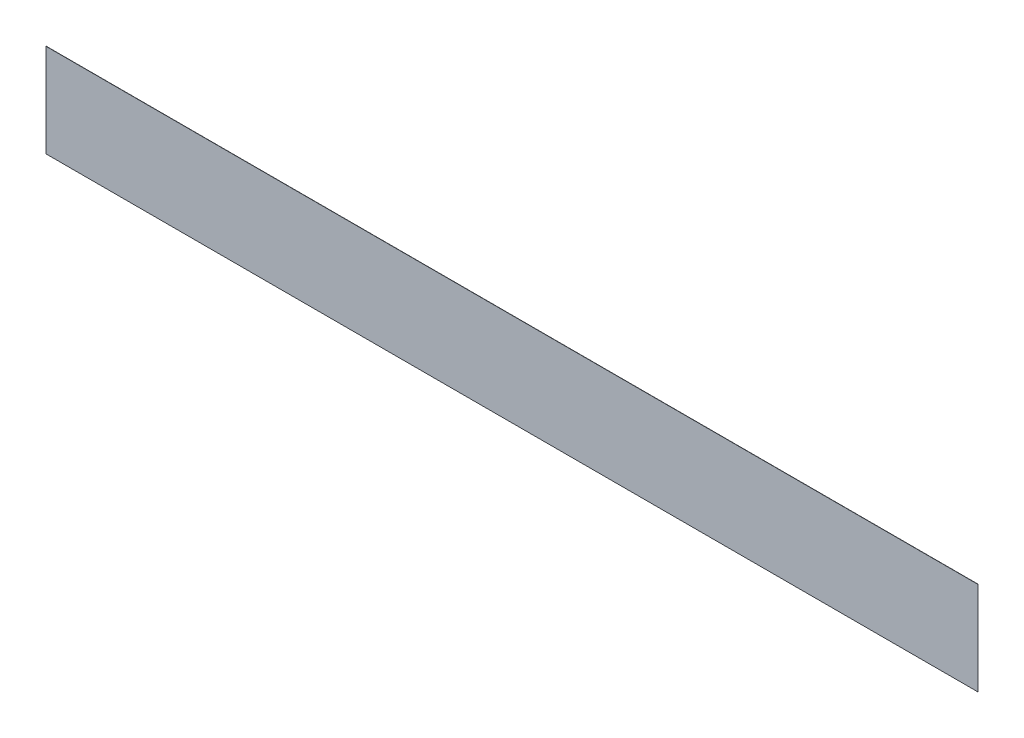
ISO-10303-21;
HEADER;
FILE_DESCRIPTION(('STEP AP214'),'2;1');
FILE_NAME('part.step','',(''),(''),'','','');
FILE_SCHEMA(('AUTOMOTIVE_DESIGN { 1 0 10303 214 1 1 1 1 }'));
ENDSEC;
DATA;
#1=APPLICATION_CONTEXT('core data for automotive mechanical design processes');
#2=APPLICATION_PROTOCOL_DEFINITION('international standard','automotive_design',2000,#1);
#3=PRODUCT_CONTEXT('',#1,'mechanical');
#4=PRODUCT('Part','Part','',(#3));
#5=PRODUCT_RELATED_PRODUCT_CATEGORY('part','',(#4));
#6=PRODUCT_DEFINITION_FORMATION('','',#4);
#7=PRODUCT_DEFINITION_CONTEXT('part definition',#1,'design');
#8=PRODUCT_DEFINITION('design','',#6,#7);
#9=PRODUCT_DEFINITION_SHAPE('','',#8);
#10=(LENGTH_UNIT() NAMED_UNIT(*) SI_UNIT(.MILLI.,.METRE.));
#11=(NAMED_UNIT(*) PLANE_ANGLE_UNIT() SI_UNIT($,.RADIAN.));
#12=(NAMED_UNIT(*) SI_UNIT($,.STERADIAN.) SOLID_ANGLE_UNIT());
#13=UNCERTAINTY_MEASURE_WITH_UNIT(LENGTH_MEASURE(1.E-05),#10,'distance_accuracy_value','');
#14=(GEOMETRIC_REPRESENTATION_CONTEXT(3) GLOBAL_UNCERTAINTY_ASSIGNED_CONTEXT((#13)) GLOBAL_UNIT_ASSIGNED_CONTEXT((#10,
#11,#12)) REPRESENTATION_CONTEXT('',''));
#15=CARTESIAN_POINT('',(0.,0.,0.));
#16=DIRECTION('',(0.,0.,1.));
#17=DIRECTION('',(1.,0.,0.));
#18=AXIS2_PLACEMENT_3D('',#15,#16,#17);
#19=CARTESIAN_POINT('',(19950.,999.999999999998,5.));
#20=DIRECTION('',(-1.,0.,0.));
#21=DIRECTION('',(0.,0.,1.));
#22=AXIS2_PLACEMENT_3D('',#19,#20,#21);
#23=PLANE('',#22);
#24=DIRECTION('',(0.,1.,0.));
#25=VECTOR('',#24,1.);
#26=CARTESIAN_POINT('',(19950.,999.999999999998,0.));
#27=LINE('',#26,#25);
#28=CARTESIAN_POINT('',(19950.,-1000.,0.));
#29=VERTEX_POINT('',#28);
#30=CARTESIAN_POINT('',(19950.,999.999999999998,0.));
#31=VERTEX_POINT('',#30);
#32=EDGE_CURVE('E96',#29,#31,#27,.T.);
#33=ORIENTED_EDGE('',*,*,#32,.T.);
#34=DIRECTION('',(0.,0.,-1.));
#35=VECTOR('',#34,1.);
#36=CARTESIAN_POINT('',(19950.,999.999999999998,5.));
#37=LINE('',#36,#35);
#38=CARTESIAN_POINT('',(19950.,999.999999999998,5.));
#39=VERTEX_POINT('',#38);
#40=EDGE_CURVE('E11',#39,#31,#37,.T.);
#41=ORIENTED_EDGE('',*,*,#40,.F.);
#42=DIRECTION('',(0.,1.,0.));
#43=VECTOR('',#42,1.);
#44=CARTESIAN_POINT('',(19950.,999.999999999998,5.));
#45=LINE('',#44,#43);
#46=CARTESIAN_POINT('',(19950.,-1000.,5.));
#47=VERTEX_POINT('',#46);
#48=EDGE_CURVE('E84',#47,#39,#45,.T.);
#49=ORIENTED_EDGE('',*,*,#48,.F.);
#50=DIRECTION('',(0.,0.,-1.));
#51=VECTOR('',#50,1.);
#52=CARTESIAN_POINT('',(19950.,-1000.,5.));
#53=LINE('',#52,#51);
#54=EDGE_CURVE('E92',#47,#29,#53,.T.);
#55=ORIENTED_EDGE('',*,*,#54,.T.);
#56=EDGE_LOOP('',(#33,#41,#49,#55));
#57=FACE_BOUND('',#56,.T.);
#58=ADVANCED_FACE('F33',(#57),#23,.F.);
#59=CARTESIAN_POINT('',(-50.0000000000007,999.999999999998,5.));
#60=DIRECTION('',(0.,-1.,0.));
#61=DIRECTION('',(0.,0.,-1.));
#62=AXIS2_PLACEMENT_3D('',#59,#60,#61);
#63=PLANE('',#62);
#64=DIRECTION('',(-1.,0.,0.));
#65=VECTOR('',#64,1.);
#66=CARTESIAN_POINT('',(-50.0000000000007,999.999999999998,0.));
#67=LINE('',#66,#65);
#68=CARTESIAN_POINT('',(-50.0000000000007,999.999999999998,0.));
#69=VERTEX_POINT('',#68);
#70=EDGE_CURVE('E88',#31,#69,#67,.T.);
#71=ORIENTED_EDGE('',*,*,#70,.T.);
#72=DIRECTION('',(0.,0.,-1.));
#73=VECTOR('',#72,1.);
#74=CARTESIAN_POINT('',(-50.0000000000007,999.999999999998,5.));
#75=LINE('',#74,#73);
#76=CARTESIAN_POINT('',(-50.0000000000007,999.999999999998,5.));
#77=VERTEX_POINT('',#76);
#78=EDGE_CURVE('E41',#77,#69,#75,.T.);
#79=ORIENTED_EDGE('',*,*,#78,.F.);
#80=DIRECTION('',(-1.,0.,0.));
#81=VECTOR('',#80,1.);
#82=CARTESIAN_POINT('',(-50.0000000000007,999.999999999998,5.));
#83=LINE('',#82,#81);
#84=EDGE_CURVE('E79',#39,#77,#83,.T.);
#85=ORIENTED_EDGE('',*,*,#84,.F.);
#86=ORIENTED_EDGE('',*,*,#40,.T.);
#87=EDGE_LOOP('',(#71,#79,#85,#86));
#88=FACE_BOUND('',#87,.T.);
#89=ADVANCED_FACE('F87',(#88),#63,.F.);
#90=CARTESIAN_POINT('',(-50.0000000000007,999.999999999998,5.));
#91=DIRECTION('',(1.,0.,0.));
#92=DIRECTION('',(0.,0.,-1.));
#93=AXIS2_PLACEMENT_3D('',#90,#91,#92);
#94=PLANE('',#93);
#95=DIRECTION('',(0.,-1.,0.));
#96=VECTOR('',#95,1.);
#97=CARTESIAN_POINT('',(-50.0000000000007,999.999999999998,0.));
#98=LINE('',#97,#96);
#99=CARTESIAN_POINT('',(-50.0000000000007,-1000.,0.));
#100=VERTEX_POINT('',#99);
#101=EDGE_CURVE('E66',#69,#100,#98,.T.);
#102=ORIENTED_EDGE('',*,*,#101,.T.);
#103=DIRECTION('',(0.,0.,-1.));
#104=VECTOR('',#103,1.);
#105=CARTESIAN_POINT('',(-50.0000000000007,-1000.,5.));
#106=LINE('',#105,#104);
#107=CARTESIAN_POINT('',(-50.0000000000007,-1000.,5.));
#108=VERTEX_POINT('',#107);
#109=EDGE_CURVE('E89',#108,#100,#106,.T.);
#110=ORIENTED_EDGE('',*,*,#109,.F.);
#111=DIRECTION('',(0.,-1.,0.));
#112=VECTOR('',#111,1.);
#113=CARTESIAN_POINT('',(-50.0000000000007,999.999999999998,5.));
#114=LINE('',#113,#112);
#115=EDGE_CURVE('E82',#77,#108,#114,.T.);
#116=ORIENTED_EDGE('',*,*,#115,.F.);
#117=ORIENTED_EDGE('',*,*,#78,.T.);
#118=EDGE_LOOP('',(#102,#110,#116,#117));
#119=FACE_BOUND('',#118,.T.);
#120=ADVANCED_FACE('F90',(#119),#94,.F.);
#121=CARTESIAN_POINT('',(-50.0000000000007,-1000.,5.));
#122=DIRECTION('',(0.,1.,0.));
#123=DIRECTION('',(0.,0.,1.));
#124=AXIS2_PLACEMENT_3D('',#121,#122,#123);
#125=PLANE('',#124);
#126=DIRECTION('',(1.,0.,0.));
#127=VECTOR('',#126,1.);
#128=CARTESIAN_POINT('',(-50.0000000000007,-1000.,0.));
#129=LINE('',#128,#127);
#130=EDGE_CURVE('E72',#100,#29,#129,.T.);
#131=ORIENTED_EDGE('',*,*,#130,.T.);
#132=ORIENTED_EDGE('',*,*,#54,.F.);
#133=DIRECTION('',(1.,0.,0.));
#134=VECTOR('',#133,1.);
#135=CARTESIAN_POINT('',(-50.0000000000007,-1000.,5.));
#136=LINE('',#135,#134);
#137=EDGE_CURVE('E49',#108,#47,#136,.T.);
#138=ORIENTED_EDGE('',*,*,#137,.F.);
#139=ORIENTED_EDGE('',*,*,#109,.T.);
#140=EDGE_LOOP('',(#131,#132,#138,#139));
#141=FACE_BOUND('',#140,.T.);
#142=ADVANCED_FACE('F103',(#141),#125,.F.);
#143=CARTESIAN_POINT('',(0.,0.,5.));
#144=DIRECTION('',(0.,0.,1.));
#145=DIRECTION('',(1.,0.,0.));
#146=AXIS2_PLACEMENT_3D('',#143,#144,#145);
#147=PLANE('',#146);
#148=ORIENTED_EDGE('',*,*,#48,.T.);
#149=ORIENTED_EDGE('',*,*,#84,.T.);
#150=ORIENTED_EDGE('',*,*,#115,.T.);
#151=ORIENTED_EDGE('',*,*,#137,.T.);
#152=EDGE_LOOP('',(#148,#149,#150,#151));
#153=FACE_BOUND('',#152,.T.);
#154=ADVANCED_FACE('F80',(#153),#147,.T.);
#155=CARTESIAN_POINT('',(0.,0.,0.));
#156=DIRECTION('',(0.,0.,1.));
#157=DIRECTION('',(1.,0.,0.));
#158=AXIS2_PLACEMENT_3D('',#155,#156,#157);
#159=PLANE('',#158);
#160=ORIENTED_EDGE('',*,*,#32,.F.);
#161=ORIENTED_EDGE('',*,*,#130,.F.);
#162=ORIENTED_EDGE('',*,*,#101,.F.);
#163=ORIENTED_EDGE('',*,*,#70,.F.);
#164=EDGE_LOOP('',(#160,#161,#162,#163));
#165=FACE_BOUND('',#164,.T.);
#166=ADVANCED_FACE('F106',(#165),#159,.F.);
#167=CLOSED_SHELL('',(#58,#89,#120,#142,#154,#166));
#168=MANIFOLD_SOLID_BREP('B2',#167);
#169=ADVANCED_BREP_SHAPE_REPRESENTATION('',(#18,#168),#14);
#170=SHAPE_DEFINITION_REPRESENTATION(#9,#169);
ENDSEC;
END-ISO-10303-21;
